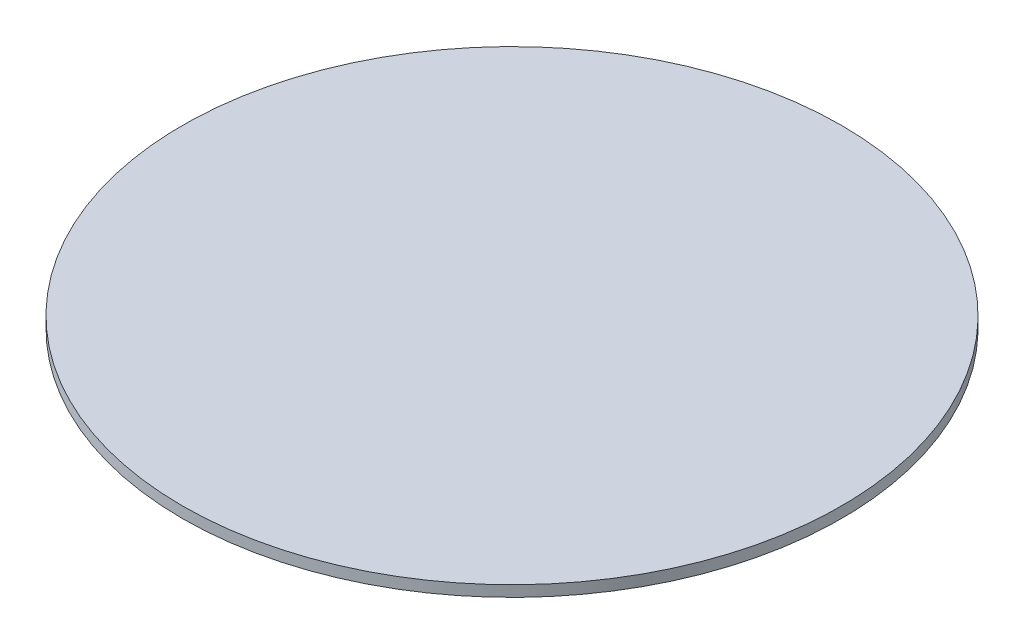
ISO-10303-21;
HEADER;
FILE_DESCRIPTION(('STEP AP214'),'2;1');
FILE_NAME('part.step','',(''),(''),'','','');
FILE_SCHEMA(('AUTOMOTIVE_DESIGN { 1 0 10303 214 1 1 1 1 }'));
ENDSEC;
DATA;
#1=APPLICATION_CONTEXT('core data for automotive mechanical design processes');
#2=APPLICATION_PROTOCOL_DEFINITION('international standard','automotive_design',2000,#1);
#3=PRODUCT_CONTEXT('',#1,'mechanical');
#4=PRODUCT('Part','Part','',(#3));
#5=PRODUCT_RELATED_PRODUCT_CATEGORY('part','',(#4));
#6=PRODUCT_DEFINITION_FORMATION('','',#4);
#7=PRODUCT_DEFINITION_CONTEXT('part definition',#1,'design');
#8=PRODUCT_DEFINITION('design','',#6,#7);
#9=PRODUCT_DEFINITION_SHAPE('','',#8);
#10=(LENGTH_UNIT() NAMED_UNIT(*) SI_UNIT(.MILLI.,.METRE.));
#11=(NAMED_UNIT(*) PLANE_ANGLE_UNIT() SI_UNIT($,.RADIAN.));
#12=(NAMED_UNIT(*) SI_UNIT($,.STERADIAN.) SOLID_ANGLE_UNIT());
#13=UNCERTAINTY_MEASURE_WITH_UNIT(LENGTH_MEASURE(1.E-05),#10,'distance_accuracy_value','');
#14=(GEOMETRIC_REPRESENTATION_CONTEXT(3) GLOBAL_UNCERTAINTY_ASSIGNED_CONTEXT((#13)) GLOBAL_UNIT_ASSIGNED_CONTEXT((#10,
#11,#12)) REPRESENTATION_CONTEXT('',''));
#15=CARTESIAN_POINT('',(0.,0.,0.));
#16=DIRECTION('',(0.,0.,1.));
#17=DIRECTION('',(1.,0.,0.));
#18=AXIS2_PLACEMENT_3D('',#15,#16,#17);
#19=CARTESIAN_POINT('',(0.,1.,0.));
#20=DIRECTION('',(0.,-1.,0.));
#21=DIRECTION('',(0.,0.,-1.));
#22=AXIS2_PLACEMENT_3D('',#19,#20,#21);
#23=CYLINDRICAL_SURFACE('',#22,30.);
#24=CARTESIAN_POINT('',(0.,1.,0.));
#25=DIRECTION('',(0.,1.,0.));
#26=DIRECTION('',(0.,0.,1.));
#27=AXIS2_PLACEMENT_3D('',#24,#25,#26);
#28=CIRCLE('',#27,30.);
#29=CARTESIAN_POINT('',(0.,1.,30.));
#30=VERTEX_POINT('',#29);
#31=EDGE_CURVE('E10',#30,#30,#28,.T.);
#32=ORIENTED_EDGE('',*,*,#31,.F.);
#33=EDGE_LOOP('',(#32));
#34=FACE_BOUND('',#33,.T.);
#35=CARTESIAN_POINT('',(0.,0.,0.));
#36=DIRECTION('',(0.,1.,0.));
#37=DIRECTION('',(0.,0.,1.));
#38=AXIS2_PLACEMENT_3D('',#35,#36,#37);
#39=CIRCLE('',#38,30.);
#40=CARTESIAN_POINT('',(0.,0.,30.));
#41=VERTEX_POINT('',#40);
#42=EDGE_CURVE('E37',#41,#41,#39,.T.);
#43=ORIENTED_EDGE('',*,*,#42,.T.);
#44=EDGE_LOOP('',(#43));
#45=FACE_BOUND('',#44,.T.);
#46=ADVANCED_FACE('F34',(#34,#45),#23,.T.);
#47=CARTESIAN_POINT('',(0.,1.,0.));
#48=DIRECTION('',(0.,1.,0.));
#49=DIRECTION('',(0.,0.,1.));
#50=AXIS2_PLACEMENT_3D('',#47,#48,#49);
#51=PLANE('',#50);
#52=ORIENTED_EDGE('',*,*,#31,.T.);
#53=EDGE_LOOP('',(#52));
#54=FACE_BOUND('',#53,.T.);
#55=ADVANCED_FACE('F49',(#54),#51,.T.);
#56=CARTESIAN_POINT('',(0.,0.,0.));
#57=DIRECTION('',(0.,1.,0.));
#58=DIRECTION('',(0.,0.,1.));
#59=AXIS2_PLACEMENT_3D('',#56,#57,#58);
#60=PLANE('',#59);
#61=ORIENTED_EDGE('',*,*,#42,.F.);
#62=EDGE_LOOP('',(#61));
#63=FACE_BOUND('',#62,.T.);
#64=ADVANCED_FACE('F47',(#63),#60,.F.);
#65=CLOSED_SHELL('',(#46,#55,#64));
#66=MANIFOLD_SOLID_BREP('B2',#65);
#67=ADVANCED_BREP_SHAPE_REPRESENTATION('',(#18,#66),#14);
#68=SHAPE_DEFINITION_REPRESENTATION(#9,#67);
ENDSEC;
END-ISO-10303-21;
